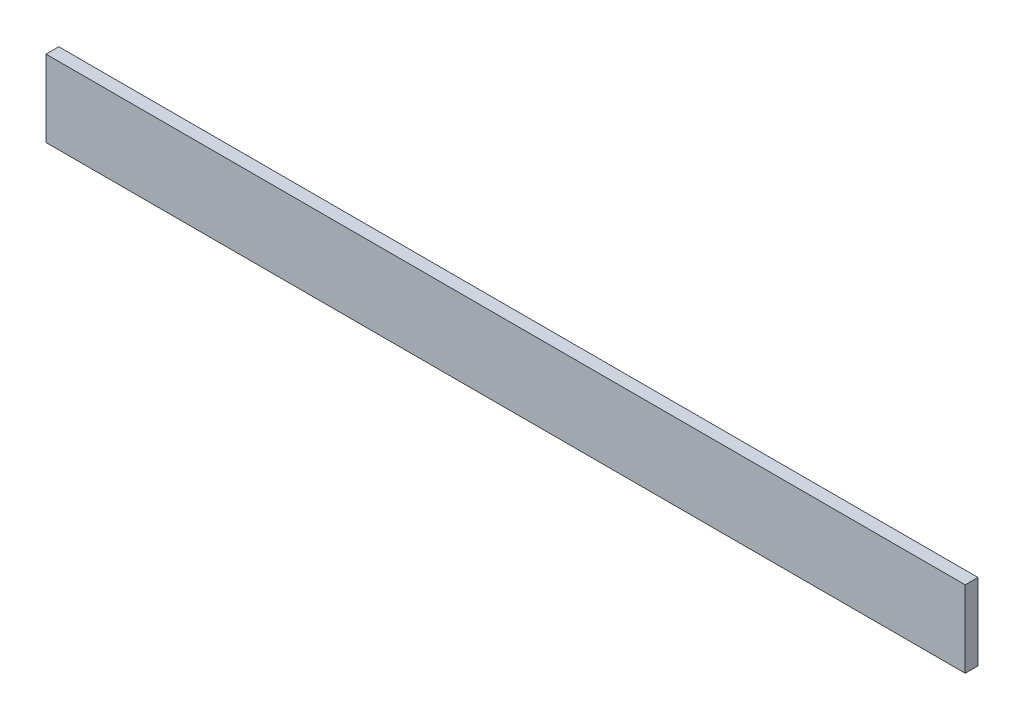
ISO-10303-21;
HEADER;
FILE_DESCRIPTION(('STEP AP214'),'2;1');
FILE_NAME('part.step','',(''),(''),'','','');
FILE_SCHEMA(('AUTOMOTIVE_DESIGN { 1 0 10303 214 1 1 1 1 }'));
ENDSEC;
DATA;
#1=APPLICATION_CONTEXT('core data for automotive mechanical design processes');
#2=APPLICATION_PROTOCOL_DEFINITION('international standard','automotive_design',2000,#1);
#3=PRODUCT_CONTEXT('',#1,'mechanical');
#4=PRODUCT('Part','Part','',(#3));
#5=PRODUCT_RELATED_PRODUCT_CATEGORY('part','',(#4));
#6=PRODUCT_DEFINITION_FORMATION('','',#4);
#7=PRODUCT_DEFINITION_CONTEXT('part definition',#1,'design');
#8=PRODUCT_DEFINITION('design','',#6,#7);
#9=PRODUCT_DEFINITION_SHAPE('','',#8);
#10=(LENGTH_UNIT() NAMED_UNIT(*) SI_UNIT(.MILLI.,.METRE.));
#11=(NAMED_UNIT(*) PLANE_ANGLE_UNIT() SI_UNIT($,.RADIAN.));
#12=(NAMED_UNIT(*) SI_UNIT($,.STERADIAN.) SOLID_ANGLE_UNIT());
#13=UNCERTAINTY_MEASURE_WITH_UNIT(LENGTH_MEASURE(1.E-05),#10,'distance_accuracy_value','');
#14=(GEOMETRIC_REPRESENTATION_CONTEXT(3) GLOBAL_UNCERTAINTY_ASSIGNED_CONTEXT((#13)) GLOBAL_UNIT_ASSIGNED_CONTEXT((#10,
#11,#12)) REPRESENTATION_CONTEXT('',''));
#15=CARTESIAN_POINT('',(0.,0.,0.));
#16=DIRECTION('',(0.,0.,1.));
#17=DIRECTION('',(1.,0.,0.));
#18=AXIS2_PLACEMENT_3D('',#15,#16,#17);
#19=CARTESIAN_POINT('',(3657.6,0.,0.));
#20=DIRECTION('',(0.,0.,-1.));
#21=DIRECTION('',(-1.,0.,0.));
#22=AXIS2_PLACEMENT_3D('',#19,#20,#21);
#23=PLANE('',#22);
#24=DIRECTION('',(0.,-1.,0.));
#25=VECTOR('',#24,1.);
#26=CARTESIAN_POINT('',(0.,0.,0.));
#27=LINE('',#26,#25);
#28=CARTESIAN_POINT('',(0.,304.8,0.));
#29=VERTEX_POINT('',#28);
#30=CARTESIAN_POINT('',(0.,0.,0.));
#31=VERTEX_POINT('',#30);
#32=EDGE_CURVE('E95',#29,#31,#27,.T.);
#33=ORIENTED_EDGE('',*,*,#32,.T.);
#34=DIRECTION('',(-1.,0.,0.));
#35=VECTOR('',#34,1.);
#36=CARTESIAN_POINT('',(3657.6,0.,0.));
#37=LINE('',#36,#35);
#38=CARTESIAN_POINT('',(3657.6,0.,0.));
#39=VERTEX_POINT('',#38);
#40=EDGE_CURVE('E11',#39,#31,#37,.T.);
#41=ORIENTED_EDGE('',*,*,#40,.F.);
#42=DIRECTION('',(0.,-1.,0.));
#43=VECTOR('',#42,1.);
#44=CARTESIAN_POINT('',(3657.6,0.,0.));
#45=LINE('',#44,#43);
#46=CARTESIAN_POINT('',(3657.6,304.8,0.));
#47=VERTEX_POINT('',#46);
#48=EDGE_CURVE('E83',#47,#39,#45,.T.);
#49=ORIENTED_EDGE('',*,*,#48,.F.);
#50=DIRECTION('',(-1.,0.,0.));
#51=VECTOR('',#50,1.);
#52=CARTESIAN_POINT('',(3657.6,304.8,0.));
#53=LINE('',#52,#51);
#54=EDGE_CURVE('E91',#47,#29,#53,.T.);
#55=ORIENTED_EDGE('',*,*,#54,.T.);
#56=EDGE_LOOP('',(#33,#41,#49,#55));
#57=FACE_BOUND('',#56,.T.);
#58=ADVANCED_FACE('F32',(#57),#23,.F.);
#59=CARTESIAN_POINT('',(3657.6,0.,0.));
#60=DIRECTION('',(0.,1.,0.));
#61=DIRECTION('',(0.,0.,1.));
#62=AXIS2_PLACEMENT_3D('',#59,#60,#61);
#63=PLANE('',#62);
#64=DIRECTION('',(0.,0.,-1.));
#65=VECTOR('',#64,1.);
#66=CARTESIAN_POINT('',(0.,0.,0.));
#67=LINE('',#66,#65);
#68=CARTESIAN_POINT('',(0.,0.,-50.8));
#69=VERTEX_POINT('',#68);
#70=EDGE_CURVE('E87',#31,#69,#67,.T.);
#71=ORIENTED_EDGE('',*,*,#70,.T.);
#72=DIRECTION('',(-1.,0.,0.));
#73=VECTOR('',#72,1.);
#74=CARTESIAN_POINT('',(3657.6,0.,-50.8));
#75=LINE('',#74,#73);
#76=CARTESIAN_POINT('',(3657.6,0.,-50.8));
#77=VERTEX_POINT('',#76);
#78=EDGE_CURVE('E40',#77,#69,#75,.T.);
#79=ORIENTED_EDGE('',*,*,#78,.F.);
#80=DIRECTION('',(0.,0.,-1.));
#81=VECTOR('',#80,1.);
#82=CARTESIAN_POINT('',(3657.6,0.,0.));
#83=LINE('',#82,#81);
#84=EDGE_CURVE('E78',#39,#77,#83,.T.);
#85=ORIENTED_EDGE('',*,*,#84,.F.);
#86=ORIENTED_EDGE('',*,*,#40,.T.);
#87=EDGE_LOOP('',(#71,#79,#85,#86));
#88=FACE_BOUND('',#87,.T.);
#89=ADVANCED_FACE('F86',(#88),#63,.F.);
#90=CARTESIAN_POINT('',(3657.6,0.,-50.8));
#91=DIRECTION('',(0.,0.,1.));
#92=DIRECTION('',(1.,0.,0.));
#93=AXIS2_PLACEMENT_3D('',#90,#91,#92);
#94=PLANE('',#93);
#95=DIRECTION('',(0.,1.,0.));
#96=VECTOR('',#95,1.);
#97=CARTESIAN_POINT('',(0.,0.,-50.8));
#98=LINE('',#97,#96);
#99=CARTESIAN_POINT('',(0.,304.8,-50.8));
#100=VERTEX_POINT('',#99);
#101=EDGE_CURVE('E65',#69,#100,#98,.T.);
#102=ORIENTED_EDGE('',*,*,#101,.T.);
#103=DIRECTION('',(-1.,0.,0.));
#104=VECTOR('',#103,1.);
#105=CARTESIAN_POINT('',(3657.6,304.8,-50.8));
#106=LINE('',#105,#104);
#107=CARTESIAN_POINT('',(3657.6,304.8,-50.8));
#108=VERTEX_POINT('',#107);
#109=EDGE_CURVE('E88',#108,#100,#106,.T.);
#110=ORIENTED_EDGE('',*,*,#109,.F.);
#111=DIRECTION('',(0.,1.,0.));
#112=VECTOR('',#111,1.);
#113=CARTESIAN_POINT('',(3657.6,0.,-50.8));
#114=LINE('',#113,#112);
#115=EDGE_CURVE('E81',#77,#108,#114,.T.);
#116=ORIENTED_EDGE('',*,*,#115,.F.);
#117=ORIENTED_EDGE('',*,*,#78,.T.);
#118=EDGE_LOOP('',(#102,#110,#116,#117));
#119=FACE_BOUND('',#118,.T.);
#120=ADVANCED_FACE('F89',(#119),#94,.F.);
#121=CARTESIAN_POINT('',(3657.6,304.8,0.));
#122=DIRECTION('',(0.,-1.,0.));
#123=DIRECTION('',(0.,0.,-1.));
#124=AXIS2_PLACEMENT_3D('',#121,#122,#123);
#125=PLANE('',#124);
#126=DIRECTION('',(0.,0.,1.));
#127=VECTOR('',#126,1.);
#128=CARTESIAN_POINT('',(0.,304.8,0.));
#129=LINE('',#128,#127);
#130=EDGE_CURVE('E71',#100,#29,#129,.T.);
#131=ORIENTED_EDGE('',*,*,#130,.T.);
#132=ORIENTED_EDGE('',*,*,#54,.F.);
#133=DIRECTION('',(0.,0.,1.));
#134=VECTOR('',#133,1.);
#135=CARTESIAN_POINT('',(3657.6,304.8,0.));
#136=LINE('',#135,#134);
#137=EDGE_CURVE('E48',#108,#47,#136,.T.);
#138=ORIENTED_EDGE('',*,*,#137,.F.);
#139=ORIENTED_EDGE('',*,*,#109,.T.);
#140=EDGE_LOOP('',(#131,#132,#138,#139));
#141=FACE_BOUND('',#140,.T.);
#142=ADVANCED_FACE('F102',(#141),#125,.F.);
#143=CARTESIAN_POINT('',(3657.6,0.,0.));
#144=DIRECTION('',(-1.,0.,0.));
#145=DIRECTION('',(0.,0.,1.));
#146=AXIS2_PLACEMENT_3D('',#143,#144,#145);
#147=PLANE('',#146);
#148=ORIENTED_EDGE('',*,*,#48,.T.);
#149=ORIENTED_EDGE('',*,*,#84,.T.);
#150=ORIENTED_EDGE('',*,*,#115,.T.);
#151=ORIENTED_EDGE('',*,*,#137,.T.);
#152=EDGE_LOOP('',(#148,#149,#150,#151));
#153=FACE_BOUND('',#152,.T.);
#154=ADVANCED_FACE('F79',(#153),#147,.F.);
#155=CARTESIAN_POINT('',(0.,0.,0.));
#156=DIRECTION('',(-1.,0.,0.));
#157=DIRECTION('',(0.,0.,1.));
#158=AXIS2_PLACEMENT_3D('',#155,#156,#157);
#159=PLANE('',#158);
#160=ORIENTED_EDGE('',*,*,#32,.F.);
#161=ORIENTED_EDGE('',*,*,#130,.F.);
#162=ORIENTED_EDGE('',*,*,#101,.F.);
#163=ORIENTED_EDGE('',*,*,#70,.F.);
#164=EDGE_LOOP('',(#160,#161,#162,#163));
#165=FACE_BOUND('',#164,.T.);
#166=ADVANCED_FACE('F105',(#165),#159,.T.);
#167=CLOSED_SHELL('',(#58,#89,#120,#142,#154,#166));
#168=MANIFOLD_SOLID_BREP('B2',#167);
#169=ADVANCED_BREP_SHAPE_REPRESENTATION('',(#18,#168),#14);
#170=SHAPE_DEFINITION_REPRESENTATION(#9,#169);
ENDSEC;
END-ISO-10303-21;
